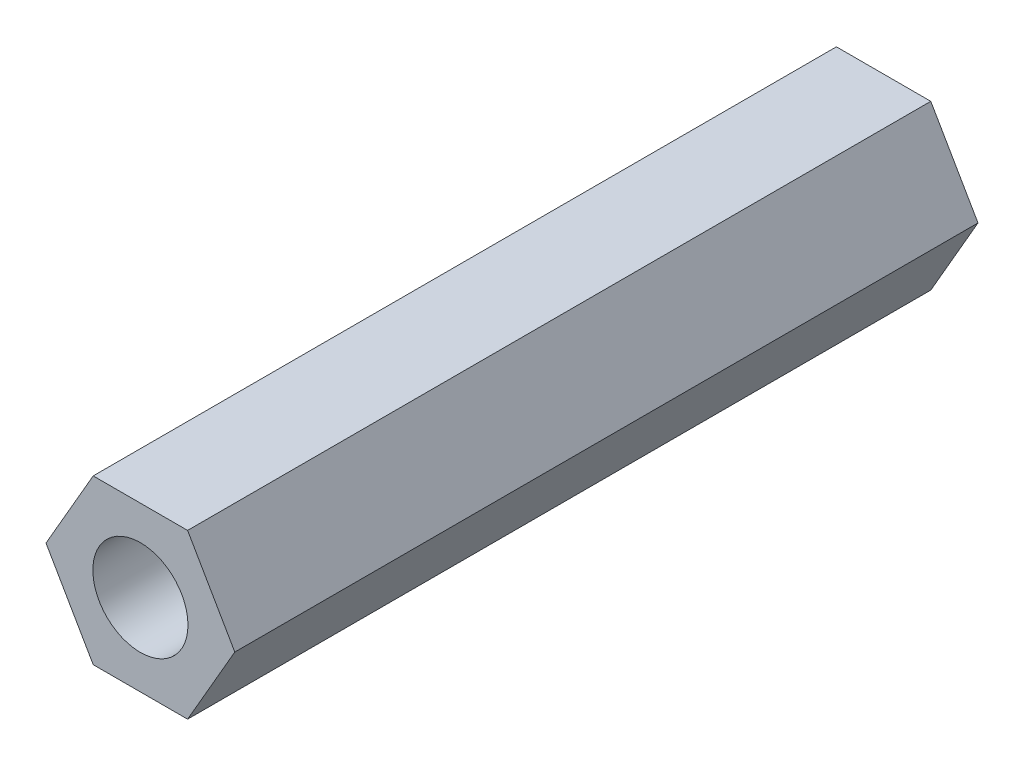
ISO-10303-21;
HEADER;
FILE_DESCRIPTION(('STEP AP214'),'2;1');
FILE_NAME('part.step','',(''),(''),'','','');
FILE_SCHEMA(('AUTOMOTIVE_DESIGN { 1 0 10303 214 1 1 1 1 }'));
ENDSEC;
DATA;
#1=APPLICATION_CONTEXT('core data for automotive mechanical design processes');
#2=APPLICATION_PROTOCOL_DEFINITION('international standard','automotive_design',2000,#1);
#3=PRODUCT_CONTEXT('',#1,'mechanical');
#4=PRODUCT('Part','Part','',(#3));
#5=PRODUCT_RELATED_PRODUCT_CATEGORY('part','',(#4));
#6=PRODUCT_DEFINITION_FORMATION('','',#4);
#7=PRODUCT_DEFINITION_CONTEXT('part definition',#1,'design');
#8=PRODUCT_DEFINITION('design','',#6,#7);
#9=PRODUCT_DEFINITION_SHAPE('','',#8);
#10=(LENGTH_UNIT() NAMED_UNIT(*) SI_UNIT(.MILLI.,.METRE.));
#11=(NAMED_UNIT(*) PLANE_ANGLE_UNIT() SI_UNIT($,.RADIAN.));
#12=(NAMED_UNIT(*) SI_UNIT($,.STERADIAN.) SOLID_ANGLE_UNIT());
#13=UNCERTAINTY_MEASURE_WITH_UNIT(LENGTH_MEASURE(1.E-05),#10,'distance_accuracy_value','');
#14=(GEOMETRIC_REPRESENTATION_CONTEXT(3) GLOBAL_UNCERTAINTY_ASSIGNED_CONTEXT((#13)) GLOBAL_UNIT_ASSIGNED_CONTEXT((#10,
#11,#12)) REPRESENTATION_CONTEXT('',''));
#15=CARTESIAN_POINT('',(0.,0.,0.));
#16=DIRECTION('',(0.,0.,1.));
#17=DIRECTION('',(1.,0.,0.));
#18=AXIS2_PLACEMENT_3D('',#15,#16,#17);
#19=CARTESIAN_POINT('',(0.,0.,-1.));
#20=DIRECTION('',(0.,0.,-1.));
#21=DIRECTION('',(1.,0.,0.));
#22=AXIS2_PLACEMENT_3D('',#19,#20,#21);
#23=CYLINDRICAL_SURFACE('',#22,1.6);
#24=CARTESIAN_POINT('',(0.,0.,0.));
#25=DIRECTION('',(0.,0.,-1.));
#26=DIRECTION('',(1.,0.,0.));
#27=AXIS2_PLACEMENT_3D('',#24,#25,#26);
#28=CIRCLE('',#27,1.6);
#29=CARTESIAN_POINT('',(1.6,0.,0.));
#30=VERTEX_POINT('',#29);
#31=EDGE_CURVE('E106',#30,#30,#28,.T.);
#32=ORIENTED_EDGE('',*,*,#31,.T.);
#33=DIRECTION('',(0.,0.,1.));
#34=VECTOR('',#33,1.);
#35=CARTESIAN_POINT('',(1.6,0.,-1.));
#36=LINE('',#35,#34);
#37=CARTESIAN_POINT('',(1.6,0.,25.));
#38=VERTEX_POINT('',#37);
#39=EDGE_CURVE('E9',#30,#38,#36,.T.);
#40=ORIENTED_EDGE('',*,*,#39,.T.);
#41=CARTESIAN_POINT('',(0.,0.,25.));
#42=DIRECTION('',(0.,0.,-1.));
#43=DIRECTION('',(1.,0.,0.));
#44=AXIS2_PLACEMENT_3D('',#41,#42,#43);
#45=CIRCLE('',#44,1.6);
#46=EDGE_CURVE('E150',#38,#38,#45,.T.);
#47=ORIENTED_EDGE('',*,*,#46,.F.);
#48=ORIENTED_EDGE('',*,*,#39,.F.);
#49=EDGE_LOOP('',(#32,#40,#47,#48));
#50=FACE_BOUND('',#49,.T.);
#51=ADVANCED_FACE('F15',(#50),#23,.F.);
#52=CARTESIAN_POINT('',(-3.175426480543,0.,0.));
#53=DIRECTION('',(0.866025403784329,0.50000000000019,0.));
#54=DIRECTION('',(0.,0.,-1.));
#55=AXIS2_PLACEMENT_3D('',#52,#53,#54);
#56=PLANE('',#55);
#57=DIRECTION('',(0.50000000000019,-0.866025403784329,0.));
#58=VECTOR('',#57,1.);
#59=CARTESIAN_POINT('',(-3.175426480543,0.,0.));
#60=LINE('',#59,#58);
#61=CARTESIAN_POINT('',(-3.175426480543,0.,0.));
#62=VERTEX_POINT('',#61);
#63=CARTESIAN_POINT('',(-1.587713240271,-2.75,0.));
#64=VERTEX_POINT('',#63);
#65=EDGE_CURVE('E102',#62,#64,#60,.T.);
#66=ORIENTED_EDGE('',*,*,#65,.T.);
#67=DIRECTION('',(0.,0.,1.));
#68=VECTOR('',#67,1.);
#69=CARTESIAN_POINT('',(-1.587713240271,-2.75,0.));
#70=LINE('',#69,#68);
#71=CARTESIAN_POINT('',(-1.587713240271,-2.75,25.));
#72=VERTEX_POINT('',#71);
#73=EDGE_CURVE('E147',#64,#72,#70,.T.);
#74=ORIENTED_EDGE('',*,*,#73,.T.);
#75=DIRECTION('',(0.50000000000019,-0.866025403784329,0.));
#76=VECTOR('',#75,1.);
#77=CARTESIAN_POINT('',(-3.175426480543,0.,25.));
#78=LINE('',#77,#76);
#79=CARTESIAN_POINT('',(-3.175426480543,0.,25.));
#80=VERTEX_POINT('',#79);
#81=EDGE_CURVE('E139',#80,#72,#78,.T.);
#82=ORIENTED_EDGE('',*,*,#81,.F.);
#83=DIRECTION('',(0.,0.,1.));
#84=VECTOR('',#83,1.);
#85=CARTESIAN_POINT('',(-3.175426480543,0.,0.));
#86=LINE('',#85,#84);
#87=EDGE_CURVE('E24',#62,#80,#86,.T.);
#88=ORIENTED_EDGE('',*,*,#87,.F.);
#89=EDGE_LOOP('',(#66,#74,#82,#88));
#90=FACE_BOUND('',#89,.T.);
#91=ADVANCED_FACE('F214',(#90),#56,.F.);
#92=CARTESIAN_POINT('',(-1.587713240271,2.75,0.));
#93=DIRECTION('',(0.866025403784329,-0.50000000000019,0.));
#94=DIRECTION('',(0.,0.,-1.));
#95=AXIS2_PLACEMENT_3D('',#92,#93,#94);
#96=PLANE('',#95);
#97=DIRECTION('',(-0.50000000000019,-0.866025403784329,0.));
#98=VECTOR('',#97,1.);
#99=CARTESIAN_POINT('',(-1.587713240271,2.75,0.));
#100=LINE('',#99,#98);
#101=CARTESIAN_POINT('',(-1.587713240271,2.75,0.));
#102=VERTEX_POINT('',#101);
#103=EDGE_CURVE('E92',#102,#62,#100,.T.);
#104=ORIENTED_EDGE('',*,*,#103,.T.);
#105=ORIENTED_EDGE('',*,*,#87,.T.);
#106=DIRECTION('',(-0.50000000000019,-0.866025403784329,0.));
#107=VECTOR('',#106,1.);
#108=CARTESIAN_POINT('',(-1.587713240271,2.75,25.));
#109=LINE('',#108,#107);
#110=CARTESIAN_POINT('',(-1.587713240271,2.75,25.));
#111=VERTEX_POINT('',#110);
#112=EDGE_CURVE('E115',#111,#80,#109,.T.);
#113=ORIENTED_EDGE('',*,*,#112,.F.);
#114=DIRECTION('',(0.,0.,1.));
#115=VECTOR('',#114,1.);
#116=CARTESIAN_POINT('',(-1.587713240271,2.75,0.));
#117=LINE('',#116,#115);
#118=EDGE_CURVE('E108',#102,#111,#117,.T.);
#119=ORIENTED_EDGE('',*,*,#118,.F.);
#120=EDGE_LOOP('',(#104,#105,#113,#119));
#121=FACE_BOUND('',#120,.T.);
#122=ADVANCED_FACE('F109',(#121),#96,.F.);
#123=CARTESIAN_POINT('',(-1.587713240271,-2.75,0.));
#124=DIRECTION('',(0.,1.,0.));
#125=DIRECTION('',(1.,0.,0.));
#126=AXIS2_PLACEMENT_3D('',#123,#124,#125);
#127=PLANE('',#126);
#128=DIRECTION('',(1.,0.,0.));
#129=VECTOR('',#128,1.);
#130=CARTESIAN_POINT('',(-1.587713240271,-2.75,0.));
#131=LINE('',#130,#129);
#132=CARTESIAN_POINT('',(1.587713240271,-2.75,0.));
#133=VERTEX_POINT('',#132);
#134=EDGE_CURVE('E132',#64,#133,#131,.T.);
#135=ORIENTED_EDGE('',*,*,#134,.T.);
#136=DIRECTION('',(0.,0.,1.));
#137=VECTOR('',#136,1.);
#138=CARTESIAN_POINT('',(1.587713240271,-2.75,0.));
#139=LINE('',#138,#137);
#140=CARTESIAN_POINT('',(1.587713240271,-2.75,25.));
#141=VERTEX_POINT('',#140);
#142=EDGE_CURVE('E124',#133,#141,#139,.T.);
#143=ORIENTED_EDGE('',*,*,#142,.T.);
#144=DIRECTION('',(1.,0.,0.));
#145=VECTOR('',#144,1.);
#146=CARTESIAN_POINT('',(-1.587713240271,-2.75,25.));
#147=LINE('',#146,#145);
#148=EDGE_CURVE('E86',#72,#141,#147,.T.);
#149=ORIENTED_EDGE('',*,*,#148,.F.);
#150=ORIENTED_EDGE('',*,*,#73,.F.);
#151=EDGE_LOOP('',(#135,#143,#149,#150));
#152=FACE_BOUND('',#151,.T.);
#153=ADVANCED_FACE('F163',(#152),#127,.F.);
#154=CARTESIAN_POINT('',(0.,0.,25.));
#155=DIRECTION('',(0.,0.,1.));
#156=DIRECTION('',(1.,0.,0.));
#157=AXIS2_PLACEMENT_3D('',#154,#155,#156);
#158=PLANE('',#157);
#159=ORIENTED_EDGE('',*,*,#46,.T.);
#160=EDGE_LOOP('',(#159));
#161=FACE_BOUND('',#160,.T.);
#162=DIRECTION('',(-0.50000000000019,0.866025403784329,0.));
#163=VECTOR('',#162,1.);
#164=CARTESIAN_POINT('',(3.175426480543,0.,25.));
#165=LINE('',#164,#163);
#166=CARTESIAN_POINT('',(3.175426480543,0.,25.));
#167=VERTEX_POINT('',#166);
#168=CARTESIAN_POINT('',(1.587713240271,2.75,25.));
#169=VERTEX_POINT('',#168);
#170=EDGE_CURVE('E245',#167,#169,#165,.T.);
#171=ORIENTED_EDGE('',*,*,#170,.T.);
#172=DIRECTION('',(-1.,0.,0.));
#173=VECTOR('',#172,1.);
#174=CARTESIAN_POINT('',(1.587713240271,2.75,25.));
#175=LINE('',#174,#173);
#176=EDGE_CURVE('E116',#169,#111,#175,.T.);
#177=ORIENTED_EDGE('',*,*,#176,.T.);
#178=ORIENTED_EDGE('',*,*,#112,.T.);
#179=ORIENTED_EDGE('',*,*,#81,.T.);
#180=ORIENTED_EDGE('',*,*,#148,.T.);
#181=DIRECTION('',(0.50000000000019,0.866025403784329,0.));
#182=VECTOR('',#181,1.);
#183=CARTESIAN_POINT('',(1.587713240271,-2.75,25.));
#184=LINE('',#183,#182);
#185=EDGE_CURVE('E126',#141,#167,#184,.T.);
#186=ORIENTED_EDGE('',*,*,#185,.T.);
#187=EDGE_LOOP('',(#171,#177,#178,#179,#180,#186));
#188=FACE_BOUND('',#187,.T.);
#189=ADVANCED_FACE('F157',(#161,#188),#158,.T.);
#190=CARTESIAN_POINT('',(0.,0.,0.));
#191=DIRECTION('',(0.,0.,1.));
#192=DIRECTION('',(1.,0.,0.));
#193=AXIS2_PLACEMENT_3D('',#190,#191,#192);
#194=PLANE('',#193);
#195=ORIENTED_EDGE('',*,*,#31,.F.);
#196=EDGE_LOOP('',(#195));
#197=FACE_BOUND('',#196,.T.);
#198=DIRECTION('',(0.50000000000019,0.866025403784329,0.));
#199=VECTOR('',#198,1.);
#200=CARTESIAN_POINT('',(1.587713240271,-2.75,0.));
#201=LINE('',#200,#199);
#202=CARTESIAN_POINT('',(3.175426480543,0.,0.));
#203=VERTEX_POINT('',#202);
#204=EDGE_CURVE('E244',#133,#203,#201,.T.);
#205=ORIENTED_EDGE('',*,*,#204,.F.);
#206=ORIENTED_EDGE('',*,*,#134,.F.);
#207=ORIENTED_EDGE('',*,*,#65,.F.);
#208=ORIENTED_EDGE('',*,*,#103,.F.);
#209=DIRECTION('',(-1.,0.,0.));
#210=VECTOR('',#209,1.);
#211=CARTESIAN_POINT('',(1.587713240271,2.75,0.));
#212=LINE('',#211,#210);
#213=CARTESIAN_POINT('',(1.587713240271,2.75,0.));
#214=VERTEX_POINT('',#213);
#215=EDGE_CURVE('E101',#214,#102,#212,.T.);
#216=ORIENTED_EDGE('',*,*,#215,.F.);
#217=DIRECTION('',(-0.50000000000019,0.866025403784329,0.));
#218=VECTOR('',#217,1.);
#219=CARTESIAN_POINT('',(3.175426480543,0.,0.));
#220=LINE('',#219,#218);
#221=EDGE_CURVE('E255',#203,#214,#220,.T.);
#222=ORIENTED_EDGE('',*,*,#221,.F.);
#223=EDGE_LOOP('',(#205,#206,#207,#208,#216,#222));
#224=FACE_BOUND('',#223,.T.);
#225=ADVANCED_FACE('F98',(#197,#224),#194,.F.);
#226=CARTESIAN_POINT('',(1.587713240271,2.75,0.));
#227=DIRECTION('',(0.,-1.,0.));
#228=DIRECTION('',(-1.,0.,0.));
#229=AXIS2_PLACEMENT_3D('',#226,#227,#228);
#230=PLANE('',#229);
#231=ORIENTED_EDGE('',*,*,#215,.T.);
#232=ORIENTED_EDGE('',*,*,#118,.T.);
#233=ORIENTED_EDGE('',*,*,#176,.F.);
#234=DIRECTION('',(0.,0.,1.));
#235=VECTOR('',#234,1.);
#236=CARTESIAN_POINT('',(1.587713240271,2.75,0.));
#237=LINE('',#236,#235);
#238=EDGE_CURVE('E120',#214,#169,#237,.T.);
#239=ORIENTED_EDGE('',*,*,#238,.F.);
#240=EDGE_LOOP('',(#231,#232,#233,#239));
#241=FACE_BOUND('',#240,.T.);
#242=ADVANCED_FACE('F119',(#241),#230,.F.);
#243=CARTESIAN_POINT('',(1.587713240271,-2.75,0.));
#244=DIRECTION('',(-0.866025403784329,0.50000000000019,0.));
#245=DIRECTION('',(0.,0.,1.));
#246=AXIS2_PLACEMENT_3D('',#243,#244,#245);
#247=PLANE('',#246);
#248=ORIENTED_EDGE('',*,*,#204,.T.);
#249=DIRECTION('',(0.,0.,1.));
#250=VECTOR('',#249,1.);
#251=CARTESIAN_POINT('',(3.175426480543,0.,0.));
#252=LINE('',#251,#250);
#253=EDGE_CURVE('E250',#203,#167,#252,.T.);
#254=ORIENTED_EDGE('',*,*,#253,.T.);
#255=ORIENTED_EDGE('',*,*,#185,.F.);
#256=ORIENTED_EDGE('',*,*,#142,.F.);
#257=EDGE_LOOP('',(#248,#254,#255,#256));
#258=FACE_BOUND('',#257,.T.);
#259=ADVANCED_FACE('F180',(#258),#247,.F.);
#260=CARTESIAN_POINT('',(3.175426480543,0.,0.));
#261=DIRECTION('',(-0.866025403784329,-0.50000000000019,0.));
#262=DIRECTION('',(-0.50000000000019,0.866025403784329,0.));
#263=AXIS2_PLACEMENT_3D('',#260,#261,#262);
#264=PLANE('',#263);
#265=ORIENTED_EDGE('',*,*,#221,.T.);
#266=ORIENTED_EDGE('',*,*,#238,.T.);
#267=ORIENTED_EDGE('',*,*,#170,.F.);
#268=ORIENTED_EDGE('',*,*,#253,.F.);
#269=EDGE_LOOP('',(#265,#266,#267,#268));
#270=FACE_BOUND('',#269,.T.);
#271=ADVANCED_FACE('F172',(#270),#264,.F.);
#272=CLOSED_SHELL('',(#51,#91,#122,#153,#189,#225,#242,#259,#271));
#273=MANIFOLD_SOLID_BREP('B1',#272);
#274=ADVANCED_BREP_SHAPE_REPRESENTATION('',(#18,#273),#14);
#275=SHAPE_DEFINITION_REPRESENTATION(#9,#274);
ENDSEC;
END-ISO-10303-21;
